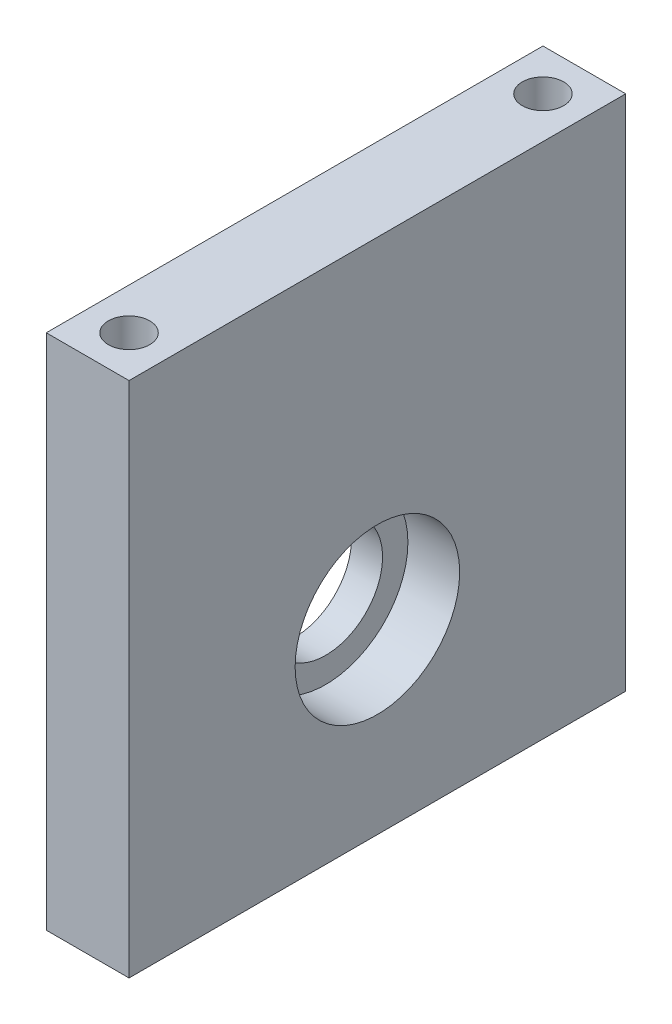
ISO-10303-21;
HEADER;
FILE_DESCRIPTION(('STEP AP214'),'2;1');
FILE_NAME('part.step','',(''),(''),'','','');
FILE_SCHEMA(('AUTOMOTIVE_DESIGN { 1 0 10303 214 1 1 1 1 }'));
ENDSEC;
DATA;
#1=APPLICATION_CONTEXT('core data for automotive mechanical design processes');
#2=APPLICATION_PROTOCOL_DEFINITION('international standard','automotive_design',2000,#1);
#3=PRODUCT_CONTEXT('',#1,'mechanical');
#4=PRODUCT('Part','Part','',(#3));
#5=PRODUCT_RELATED_PRODUCT_CATEGORY('part','',(#4));
#6=PRODUCT_DEFINITION_FORMATION('','',#4);
#7=PRODUCT_DEFINITION_CONTEXT('part definition',#1,'design');
#8=PRODUCT_DEFINITION('design','',#6,#7);
#9=PRODUCT_DEFINITION_SHAPE('','',#8);
#10=(LENGTH_UNIT() NAMED_UNIT(*) SI_UNIT(.MILLI.,.METRE.));
#11=(NAMED_UNIT(*) PLANE_ANGLE_UNIT() SI_UNIT($,.RADIAN.));
#12=(NAMED_UNIT(*) SI_UNIT($,.STERADIAN.) SOLID_ANGLE_UNIT());
#13=UNCERTAINTY_MEASURE_WITH_UNIT(LENGTH_MEASURE(1.E-05),#10,'distance_accuracy_value','');
#14=(GEOMETRIC_REPRESENTATION_CONTEXT(3) GLOBAL_UNCERTAINTY_ASSIGNED_CONTEXT((#13)) GLOBAL_UNIT_ASSIGNED_CONTEXT((#10,
#11,#12)) REPRESENTATION_CONTEXT('',''));
#15=CARTESIAN_POINT('',(0.,0.,0.));
#16=DIRECTION('',(0.,0.,1.));
#17=DIRECTION('',(1.,0.,0.));
#18=AXIS2_PLACEMENT_3D('',#15,#16,#17);
#19=CARTESIAN_POINT('',(-2.,18.,-24.));
#20=DIRECTION('',(1.,0.,0.));
#21=DIRECTION('',(0.,0.,-1.));
#22=AXIS2_PLACEMENT_3D('',#19,#20,#21);
#23=CYLINDRICAL_SURFACE('',#22,7.95);
#24=CARTESIAN_POINT('',(8.,18.,-24.));
#25=DIRECTION('',(1.,0.,0.));
#26=DIRECTION('',(0.,0.,-1.));
#27=AXIS2_PLACEMENT_3D('',#24,#25,#26);
#28=CIRCLE('',#27,7.95);
#29=CARTESIAN_POINT('',(8.,18.,-31.95));
#30=VERTEX_POINT('',#29);
#31=EDGE_CURVE('E111',#30,#30,#28,.T.);
#32=ORIENTED_EDGE('',*,*,#31,.T.);
#33=EDGE_LOOP('',(#32));
#34=FACE_BOUND('',#33,.T.);
#35=CARTESIAN_POINT('',(3.,18.,-24.));
#36=DIRECTION('',(-1.,0.,0.));
#37=DIRECTION('',(0.,0.,1.));
#38=AXIS2_PLACEMENT_3D('',#35,#36,#37);
#39=CIRCLE('',#38,7.95);
#40=CARTESIAN_POINT('',(3.,18.,-16.05));
#41=VERTEX_POINT('',#40);
#42=EDGE_CURVE('E11',#41,#41,#39,.F.);
#43=ORIENTED_EDGE('',*,*,#42,.F.);
#44=EDGE_LOOP('',(#43));
#45=FACE_BOUND('',#44,.T.);
#46=ADVANCED_FACE('F40',(#34,#45),#23,.F.);
#47=CARTESIAN_POINT('',(0.,50.,-48.));
#48=DIRECTION('',(0.,0.,1.));
#49=DIRECTION('',(1.,0.,0.));
#50=AXIS2_PLACEMENT_3D('',#47,#48,#49);
#51=PLANE('',#50);
#52=DIRECTION('',(-1.,0.,0.));
#53=VECTOR('',#52,1.);
#54=CARTESIAN_POINT('',(0.,0.,-48.));
#55=LINE('',#54,#53);
#56=CARTESIAN_POINT('',(8.,0.,-48.));
#57=VERTEX_POINT('',#56);
#58=CARTESIAN_POINT('',(0.,0.,-48.));
#59=VERTEX_POINT('',#58);
#60=EDGE_CURVE('E108',#57,#59,#55,.T.);
#61=ORIENTED_EDGE('',*,*,#60,.T.);
#62=DIRECTION('',(0.,-1.,0.));
#63=VECTOR('',#62,1.);
#64=CARTESIAN_POINT('',(0.,50.,-48.));
#65=LINE('',#64,#63);
#66=CARTESIAN_POINT('',(0.,50.,-48.));
#67=VERTEX_POINT('',#66);
#68=EDGE_CURVE('E49',#67,#59,#65,.T.);
#69=ORIENTED_EDGE('',*,*,#68,.F.);
#70=DIRECTION('',(-1.,0.,0.));
#71=VECTOR('',#70,1.);
#72=CARTESIAN_POINT('',(0.,50.,-48.));
#73=LINE('',#72,#71);
#74=CARTESIAN_POINT('',(8.,50.,-48.));
#75=VERTEX_POINT('',#74);
#76=EDGE_CURVE('E93',#75,#67,#73,.T.);
#77=ORIENTED_EDGE('',*,*,#76,.F.);
#78=DIRECTION('',(0.,-1.,0.));
#79=VECTOR('',#78,1.);
#80=CARTESIAN_POINT('',(8.,50.,-48.));
#81=LINE('',#80,#79);
#82=EDGE_CURVE('E104',#75,#57,#81,.T.);
#83=ORIENTED_EDGE('',*,*,#82,.T.);
#84=EDGE_LOOP('',(#61,#69,#77,#83));
#85=FACE_BOUND('',#84,.T.);
#86=ADVANCED_FACE('F42',(#85),#51,.F.);
#87=CARTESIAN_POINT('',(0.,50.,0.));
#88=DIRECTION('',(1.,0.,0.));
#89=DIRECTION('',(0.,0.,-1.));
#90=AXIS2_PLACEMENT_3D('',#87,#88,#89);
#91=PLANE('',#90);
#92=DIRECTION('',(0.,0.,1.));
#93=VECTOR('',#92,1.);
#94=CARTESIAN_POINT('',(0.,0.,0.));
#95=LINE('',#94,#93);
#96=CARTESIAN_POINT('',(0.,0.,0.));
#97=VERTEX_POINT('',#96);
#98=EDGE_CURVE('E99',#59,#97,#95,.T.);
#99=ORIENTED_EDGE('',*,*,#98,.T.);
#100=DIRECTION('',(0.,-1.,0.));
#101=VECTOR('',#100,1.);
#102=CARTESIAN_POINT('',(0.,50.,0.));
#103=LINE('',#102,#101);
#104=CARTESIAN_POINT('',(0.,50.,0.));
#105=VERTEX_POINT('',#104);
#106=EDGE_CURVE('E96',#105,#97,#103,.T.);
#107=ORIENTED_EDGE('',*,*,#106,.F.);
#108=DIRECTION('',(0.,0.,1.));
#109=VECTOR('',#108,1.);
#110=CARTESIAN_POINT('',(0.,50.,0.));
#111=LINE('',#110,#109);
#112=EDGE_CURVE('E88',#67,#105,#111,.T.);
#113=ORIENTED_EDGE('',*,*,#112,.F.);
#114=ORIENTED_EDGE('',*,*,#68,.T.);
#115=EDGE_LOOP('',(#99,#107,#113,#114));
#116=FACE_BOUND('',#115,.T.);
#117=CARTESIAN_POINT('',(0.,18.,-24.));
#118=DIRECTION('',(-1.,0.,0.));
#119=DIRECTION('',(0.,0.,1.));
#120=AXIS2_PLACEMENT_3D('',#117,#118,#119);
#121=CIRCLE('',#120,5.5);
#122=CARTESIAN_POINT('',(0.,18.,-18.5));
#123=VERTEX_POINT('',#122);
#124=EDGE_CURVE('E203',#123,#123,#121,.T.);
#125=ORIENTED_EDGE('',*,*,#124,.F.);
#126=EDGE_LOOP('',(#125));
#127=FACE_BOUND('',#126,.T.);
#128=ADVANCED_FACE('F97',(#116,#127),#91,.F.);
#129=CARTESIAN_POINT('',(0.,50.,0.));
#130=DIRECTION('',(0.,0.,-1.));
#131=DIRECTION('',(-1.,0.,0.));
#132=AXIS2_PLACEMENT_3D('',#129,#130,#131);
#133=PLANE('',#132);
#134=DIRECTION('',(1.,0.,0.));
#135=VECTOR('',#134,1.);
#136=CARTESIAN_POINT('',(0.,0.,0.));
#137=LINE('',#136,#135);
#138=CARTESIAN_POINT('',(8.,0.,0.));
#139=VERTEX_POINT('',#138);
#140=EDGE_CURVE('E74',#97,#139,#137,.T.);
#141=ORIENTED_EDGE('',*,*,#140,.T.);
#142=DIRECTION('',(0.,-1.,0.));
#143=VECTOR('',#142,1.);
#144=CARTESIAN_POINT('',(8.,50.,0.));
#145=LINE('',#144,#143);
#146=CARTESIAN_POINT('',(8.,50.,0.));
#147=VERTEX_POINT('',#146);
#148=EDGE_CURVE('E100',#147,#139,#145,.T.);
#149=ORIENTED_EDGE('',*,*,#148,.F.);
#150=DIRECTION('',(1.,0.,0.));
#151=VECTOR('',#150,1.);
#152=CARTESIAN_POINT('',(0.,50.,0.));
#153=LINE('',#152,#151);
#154=EDGE_CURVE('E91',#105,#147,#153,.T.);
#155=ORIENTED_EDGE('',*,*,#154,.F.);
#156=ORIENTED_EDGE('',*,*,#106,.T.);
#157=EDGE_LOOP('',(#141,#149,#155,#156));
#158=FACE_BOUND('',#157,.T.);
#159=ADVANCED_FACE('F102',(#158),#133,.F.);
#160=CARTESIAN_POINT('',(8.,50.,0.));
#161=DIRECTION('',(-1.,0.,0.));
#162=DIRECTION('',(0.,0.,1.));
#163=AXIS2_PLACEMENT_3D('',#160,#161,#162);
#164=PLANE('',#163);
#165=ORIENTED_EDGE('',*,*,#31,.F.);
#166=EDGE_LOOP('',(#165));
#167=FACE_BOUND('',#166,.T.);
#168=DIRECTION('',(0.,0.,-1.));
#169=VECTOR('',#168,1.);
#170=CARTESIAN_POINT('',(8.,0.,0.));
#171=LINE('',#170,#169);
#172=EDGE_CURVE('E80',#139,#57,#171,.T.);
#173=ORIENTED_EDGE('',*,*,#172,.T.);
#174=ORIENTED_EDGE('',*,*,#82,.F.);
#175=DIRECTION('',(0.,0.,-1.));
#176=VECTOR('',#175,1.);
#177=CARTESIAN_POINT('',(8.,50.,0.));
#178=LINE('',#177,#176);
#179=EDGE_CURVE('E57',#147,#75,#178,.T.);
#180=ORIENTED_EDGE('',*,*,#179,.F.);
#181=ORIENTED_EDGE('',*,*,#148,.T.);
#182=EDGE_LOOP('',(#173,#174,#180,#181));
#183=FACE_BOUND('',#182,.T.);
#184=ADVANCED_FACE('F131',(#167,#183),#164,.F.);
#185=CARTESIAN_POINT('',(0.,50.,0.));
#186=DIRECTION('',(0.,1.,0.));
#187=DIRECTION('',(0.,0.,1.));
#188=AXIS2_PLACEMENT_3D('',#185,#186,#187);
#189=PLANE('',#188);
#190=CARTESIAN_POINT('',(4.,50.,-44.));
#191=DIRECTION('',(0.,1.,0.));
#192=DIRECTION('',(0.,0.,1.));
#193=AXIS2_PLACEMENT_3D('',#190,#191,#192);
#194=CIRCLE('',#193,2.);
#195=CARTESIAN_POINT('',(4.,50.,-42.));
#196=VERTEX_POINT('',#195);
#197=EDGE_CURVE('E186',#196,#196,#194,.T.);
#198=ORIENTED_EDGE('',*,*,#197,.F.);
#199=EDGE_LOOP('',(#198));
#200=FACE_BOUND('',#199,.T.);
#201=CARTESIAN_POINT('',(4.,50.,-4.));
#202=DIRECTION('',(0.,1.,0.));
#203=DIRECTION('',(0.,0.,1.));
#204=AXIS2_PLACEMENT_3D('',#201,#202,#203);
#205=CIRCLE('',#204,2.);
#206=CARTESIAN_POINT('',(4.,50.,-2.));
#207=VERTEX_POINT('',#206);
#208=EDGE_CURVE('E197',#207,#207,#205,.T.);
#209=ORIENTED_EDGE('',*,*,#208,.F.);
#210=EDGE_LOOP('',(#209));
#211=FACE_BOUND('',#210,.T.);
#212=ORIENTED_EDGE('',*,*,#76,.T.);
#213=ORIENTED_EDGE('',*,*,#112,.T.);
#214=ORIENTED_EDGE('',*,*,#154,.T.);
#215=ORIENTED_EDGE('',*,*,#179,.T.);
#216=EDGE_LOOP('',(#212,#213,#214,#215));
#217=FACE_BOUND('',#216,.T.);
#218=ADVANCED_FACE('F89',(#200,#211,#217),#189,.T.);
#219=CARTESIAN_POINT('',(0.,0.,0.));
#220=DIRECTION('',(0.,1.,0.));
#221=DIRECTION('',(0.,0.,1.));
#222=AXIS2_PLACEMENT_3D('',#219,#220,#221);
#223=PLANE('',#222);
#224=CARTESIAN_POINT('',(4.,0.,-44.));
#225=DIRECTION('',(0.,-1.,0.));
#226=DIRECTION('',(0.,0.,-1.));
#227=AXIS2_PLACEMENT_3D('',#224,#225,#226);
#228=CIRCLE('',#227,2.);
#229=CARTESIAN_POINT('',(4.,0.,-46.));
#230=VERTEX_POINT('',#229);
#231=EDGE_CURVE('E204',#230,#230,#228,.T.);
#232=ORIENTED_EDGE('',*,*,#231,.F.);
#233=EDGE_LOOP('',(#232));
#234=FACE_BOUND('',#233,.T.);
#235=CARTESIAN_POINT('',(4.,0.,-4.));
#236=DIRECTION('',(0.,-1.,0.));
#237=DIRECTION('',(0.,0.,-1.));
#238=AXIS2_PLACEMENT_3D('',#235,#236,#237);
#239=CIRCLE('',#238,2.);
#240=CARTESIAN_POINT('',(4.,0.,-6.));
#241=VERTEX_POINT('',#240);
#242=EDGE_CURVE('E185',#241,#241,#239,.T.);
#243=ORIENTED_EDGE('',*,*,#242,.F.);
#244=EDGE_LOOP('',(#243));
#245=FACE_BOUND('',#244,.T.);
#246=ORIENTED_EDGE('',*,*,#60,.F.);
#247=ORIENTED_EDGE('',*,*,#172,.F.);
#248=ORIENTED_EDGE('',*,*,#140,.F.);
#249=ORIENTED_EDGE('',*,*,#98,.F.);
#250=EDGE_LOOP('',(#246,#247,#248,#249));
#251=FACE_BOUND('',#250,.T.);
#252=ADVANCED_FACE('F119',(#234,#245,#251),#223,.F.);
#253=CARTESIAN_POINT('',(3.,18.,-24.));
#254=DIRECTION('',(-1.,0.,0.));
#255=DIRECTION('',(0.,0.,1.));
#256=AXIS2_PLACEMENT_3D('',#253,#254,#255);
#257=PLANE('',#256);
#258=CARTESIAN_POINT('',(3.,18.,-24.));
#259=DIRECTION('',(-1.,0.,0.));
#260=DIRECTION('',(0.,0.,1.));
#261=AXIS2_PLACEMENT_3D('',#258,#259,#260);
#262=CIRCLE('',#261,5.5);
#263=CARTESIAN_POINT('',(3.,18.,-18.5));
#264=VERTEX_POINT('',#263);
#265=EDGE_CURVE('E209',#264,#264,#262,.T.);
#266=ORIENTED_EDGE('',*,*,#265,.T.);
#267=EDGE_LOOP('',(#266));
#268=FACE_BOUND('',#267,.T.);
#269=ORIENTED_EDGE('',*,*,#42,.T.);
#270=EDGE_LOOP('',(#269));
#271=FACE_BOUND('',#270,.T.);
#272=ADVANCED_FACE('F121',(#268,#271),#257,.F.);
#273=CARTESIAN_POINT('',(3.,18.,-24.));
#274=DIRECTION('',(-1.,0.,0.));
#275=DIRECTION('',(0.,0.,1.));
#276=AXIS2_PLACEMENT_3D('',#273,#274,#275);
#277=CYLINDRICAL_SURFACE('',#276,5.5);
#278=ORIENTED_EDGE('',*,*,#265,.F.);
#279=EDGE_LOOP('',(#278));
#280=FACE_BOUND('',#279,.T.);
#281=ORIENTED_EDGE('',*,*,#124,.T.);
#282=EDGE_LOOP('',(#281));
#283=FACE_BOUND('',#282,.T.);
#284=ADVANCED_FACE('F128',(#280,#283),#277,.F.);
#285=CARTESIAN_POINT('',(4.,15.,-4.));
#286=DIRECTION('',(0.,-1.,0.));
#287=DIRECTION('',(0.,0.,-1.));
#288=AXIS2_PLACEMENT_3D('',#285,#286,#287);
#289=CYLINDRICAL_SURFACE('',#288,2.);
#290=CARTESIAN_POINT('',(4.,15.,-4.));
#291=DIRECTION('',(0.,-1.,0.));
#292=DIRECTION('',(0.,0.,-1.));
#293=AXIS2_PLACEMENT_3D('',#290,#291,#292);
#294=CIRCLE('',#293,2.);
#295=CARTESIAN_POINT('',(4.,15.,-6.));
#296=VERTEX_POINT('',#295);
#297=EDGE_CURVE('E189',#296,#296,#294,.T.);
#298=ORIENTED_EDGE('',*,*,#297,.F.);
#299=EDGE_LOOP('',(#298));
#300=FACE_BOUND('',#299,.T.);
#301=ORIENTED_EDGE('',*,*,#242,.T.);
#302=EDGE_LOOP('',(#301));
#303=FACE_BOUND('',#302,.T.);
#304=ADVANCED_FACE('F148',(#300,#303),#289,.F.);
#305=CARTESIAN_POINT('',(4.,15.,-4.));
#306=DIRECTION('',(0.,-1.,0.));
#307=DIRECTION('',(0.,0.,-1.));
#308=AXIS2_PLACEMENT_3D('',#305,#306,#307);
#309=PLANE('',#308);
#310=ORIENTED_EDGE('',*,*,#297,.T.);
#311=EDGE_LOOP('',(#310));
#312=FACE_BOUND('',#311,.T.);
#313=ADVANCED_FACE('F152',(#312),#309,.T.);
#314=CARTESIAN_POINT('',(4.,15.,-44.));
#315=DIRECTION('',(0.,-1.,0.));
#316=DIRECTION('',(0.,0.,-1.));
#317=AXIS2_PLACEMENT_3D('',#314,#315,#316);
#318=CYLINDRICAL_SURFACE('',#317,2.);
#319=CARTESIAN_POINT('',(4.,15.,-44.));
#320=DIRECTION('',(0.,-1.,0.));
#321=DIRECTION('',(0.,0.,-1.));
#322=AXIS2_PLACEMENT_3D('',#319,#320,#321);
#323=CIRCLE('',#322,2.);
#324=CARTESIAN_POINT('',(4.,15.,-46.));
#325=VERTEX_POINT('',#324);
#326=EDGE_CURVE('E200',#325,#325,#323,.T.);
#327=ORIENTED_EDGE('',*,*,#326,.F.);
#328=EDGE_LOOP('',(#327));
#329=FACE_BOUND('',#328,.T.);
#330=ORIENTED_EDGE('',*,*,#231,.T.);
#331=EDGE_LOOP('',(#330));
#332=FACE_BOUND('',#331,.T.);
#333=ADVANCED_FACE('F156',(#329,#332),#318,.F.);
#334=CARTESIAN_POINT('',(4.,15.,-44.));
#335=DIRECTION('',(0.,-1.,0.));
#336=DIRECTION('',(0.,0.,-1.));
#337=AXIS2_PLACEMENT_3D('',#334,#335,#336);
#338=PLANE('',#337);
#339=ORIENTED_EDGE('',*,*,#326,.T.);
#340=EDGE_LOOP('',(#339));
#341=FACE_BOUND('',#340,.T.);
#342=ADVANCED_FACE('F160',(#341),#338,.T.);
#343=CARTESIAN_POINT('',(4.,35.,-4.));
#344=DIRECTION('',(0.,1.,0.));
#345=DIRECTION('',(0.,0.,1.));
#346=AXIS2_PLACEMENT_3D('',#343,#344,#345);
#347=CYLINDRICAL_SURFACE('',#346,2.);
#348=CARTESIAN_POINT('',(4.,35.,-4.));
#349=DIRECTION('',(0.,1.,0.));
#350=DIRECTION('',(0.,0.,1.));
#351=AXIS2_PLACEMENT_3D('',#348,#349,#350);
#352=CIRCLE('',#351,2.);
#353=CARTESIAN_POINT('',(4.,35.,-2.));
#354=VERTEX_POINT('',#353);
#355=EDGE_CURVE('E192',#354,#354,#352,.T.);
#356=ORIENTED_EDGE('',*,*,#355,.F.);
#357=EDGE_LOOP('',(#356));
#358=FACE_BOUND('',#357,.T.);
#359=ORIENTED_EDGE('',*,*,#208,.T.);
#360=EDGE_LOOP('',(#359));
#361=FACE_BOUND('',#360,.T.);
#362=ADVANCED_FACE('F164',(#358,#361),#347,.F.);
#363=CARTESIAN_POINT('',(4.,35.,-4.));
#364=DIRECTION('',(0.,1.,0.));
#365=DIRECTION('',(0.,0.,1.));
#366=AXIS2_PLACEMENT_3D('',#363,#364,#365);
#367=PLANE('',#366);
#368=ORIENTED_EDGE('',*,*,#355,.T.);
#369=EDGE_LOOP('',(#368));
#370=FACE_BOUND('',#369,.T.);
#371=ADVANCED_FACE('F168',(#370),#367,.T.);
#372=CARTESIAN_POINT('',(4.,35.,-44.));
#373=DIRECTION('',(0.,1.,0.));
#374=DIRECTION('',(0.,0.,1.));
#375=AXIS2_PLACEMENT_3D('',#372,#373,#374);
#376=CYLINDRICAL_SURFACE('',#375,2.);
#377=CARTESIAN_POINT('',(4.,35.,-44.));
#378=DIRECTION('',(0.,1.,0.));
#379=DIRECTION('',(0.,0.,1.));
#380=AXIS2_PLACEMENT_3D('',#377,#378,#379);
#381=CIRCLE('',#380,2.);
#382=CARTESIAN_POINT('',(4.,35.,-42.));
#383=VERTEX_POINT('',#382);
#384=EDGE_CURVE('E184',#383,#383,#381,.T.);
#385=ORIENTED_EDGE('',*,*,#384,.F.);
#386=EDGE_LOOP('',(#385));
#387=FACE_BOUND('',#386,.T.);
#388=ORIENTED_EDGE('',*,*,#197,.T.);
#389=EDGE_LOOP('',(#388));
#390=FACE_BOUND('',#389,.T.);
#391=ADVANCED_FACE('F172',(#387,#390),#376,.F.);
#392=CARTESIAN_POINT('',(4.,35.,-44.));
#393=DIRECTION('',(0.,1.,0.));
#394=DIRECTION('',(0.,0.,1.));
#395=AXIS2_PLACEMENT_3D('',#392,#393,#394);
#396=PLANE('',#395);
#397=ORIENTED_EDGE('',*,*,#384,.T.);
#398=EDGE_LOOP('',(#397));
#399=FACE_BOUND('',#398,.T.);
#400=ADVANCED_FACE('F176',(#399),#396,.T.);
#401=CLOSED_SHELL('',(#46,#86,#128,#159,#184,#218,#252,#272,#284,#304,#313,#333,#342,#362,#371,
#391,#400));
#402=MANIFOLD_SOLID_BREP('B2',#401);
#403=ADVANCED_BREP_SHAPE_REPRESENTATION('',(#18,#402),#14);
#404=SHAPE_DEFINITION_REPRESENTATION(#9,#403);
ENDSEC;
END-ISO-10303-21;
